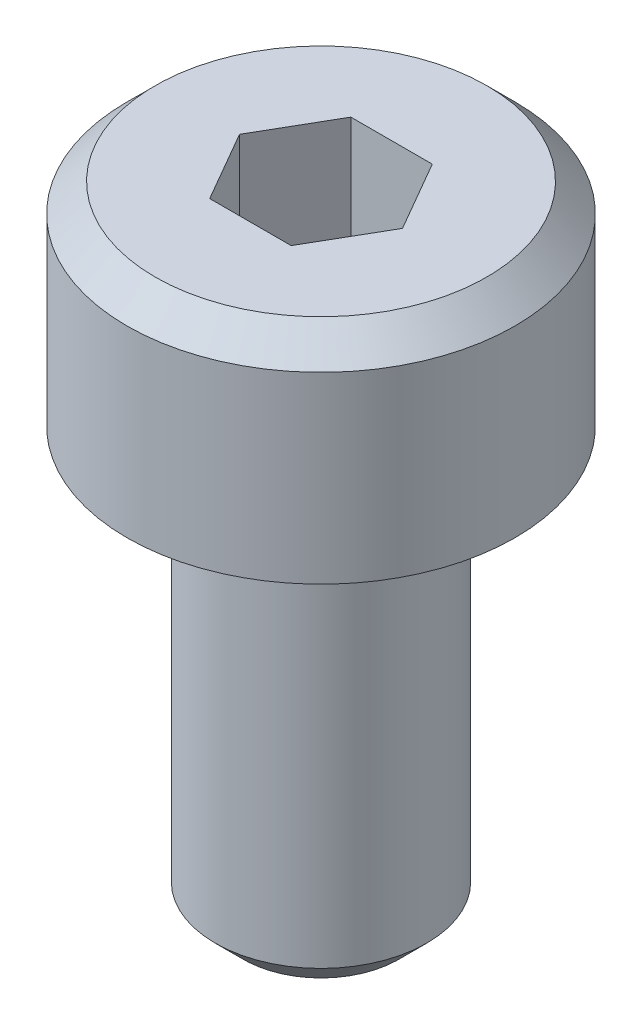
ISO-10303-21;
HEADER;
FILE_DESCRIPTION(('STEP AP214'),'2;1');
FILE_NAME('part.step','',(''),(''),'','','');
FILE_SCHEMA(('AUTOMOTIVE_DESIGN { 1 0 10303 214 1 1 1 1 }'));
ENDSEC;
DATA;
#1=APPLICATION_CONTEXT('core data for automotive mechanical design processes');
#2=APPLICATION_PROTOCOL_DEFINITION('international standard','automotive_design',2000,#1);
#3=PRODUCT_CONTEXT('',#1,'mechanical');
#4=PRODUCT('Part','Part','',(#3));
#5=PRODUCT_RELATED_PRODUCT_CATEGORY('part','',(#4));
#6=PRODUCT_DEFINITION_FORMATION('','',#4);
#7=PRODUCT_DEFINITION_CONTEXT('part definition',#1,'design');
#8=PRODUCT_DEFINITION('design','',#6,#7);
#9=PRODUCT_DEFINITION_SHAPE('','',#8);
#10=(LENGTH_UNIT() NAMED_UNIT(*) SI_UNIT(.MILLI.,.METRE.));
#11=(NAMED_UNIT(*) PLANE_ANGLE_UNIT() SI_UNIT($,.RADIAN.));
#12=(NAMED_UNIT(*) SI_UNIT($,.STERADIAN.) SOLID_ANGLE_UNIT());
#13=UNCERTAINTY_MEASURE_WITH_UNIT(LENGTH_MEASURE(1.E-05),#10,'distance_accuracy_value','');
#14=(GEOMETRIC_REPRESENTATION_CONTEXT(3) GLOBAL_UNCERTAINTY_ASSIGNED_CONTEXT((#13)) GLOBAL_UNIT_ASSIGNED_CONTEXT((#10,
#11,#12)) REPRESENTATION_CONTEXT('',''));
#15=CARTESIAN_POINT('',(0.,0.,0.));
#16=DIRECTION('',(0.,0.,1.));
#17=DIRECTION('',(1.,0.,0.));
#18=AXIS2_PLACEMENT_3D('',#15,#16,#17);
#19=CARTESIAN_POINT('',(0.,9.,0.));
#20=DIRECTION('',(0.,1.,0.));
#21=DIRECTION('',(0.,0.,1.));
#22=AXIS2_PLACEMENT_3D('',#19,#20,#21);
#23=PLANE('',#22);
#24=DIRECTION('',(0.499999999999999,0.,-0.866025403784439));
#25=VECTOR('',#24,1.);
#26=CARTESIAN_POINT('',(0.577350269189626,9.,1.));
#27=LINE('',#26,#25);
#28=CARTESIAN_POINT('',(0.577350269189626,9.,1.));
#29=VERTEX_POINT('',#28);
#30=CARTESIAN_POINT('',(1.15470053837925,9.,0.));
#31=VERTEX_POINT('',#30);
#32=EDGE_CURVE('E55',#29,#31,#27,.T.);
#33=ORIENTED_EDGE('',*,*,#32,.F.);
#34=DIRECTION('',(1.,0.,0.));
#35=VECTOR('',#34,1.);
#36=CARTESIAN_POINT('',(-0.577350269189626,9.,1.));
#37=LINE('',#36,#35);
#38=CARTESIAN_POINT('',(-0.577350269189626,9.,1.));
#39=VERTEX_POINT('',#38);
#40=EDGE_CURVE('E148',#39,#29,#37,.T.);
#41=ORIENTED_EDGE('',*,*,#40,.F.);
#42=DIRECTION('',(0.5,0.,0.866025403784439));
#43=VECTOR('',#42,1.);
#44=CARTESIAN_POINT('',(-1.15470053837925,9.,0.));
#45=LINE('',#44,#43);
#46=CARTESIAN_POINT('',(-1.15470053837925,9.,0.));
#47=VERTEX_POINT('',#46);
#48=EDGE_CURVE('E145',#47,#39,#45,.T.);
#49=ORIENTED_EDGE('',*,*,#48,.F.);
#50=DIRECTION('',(-0.5,0.,0.866025403784439));
#51=VECTOR('',#50,1.);
#52=CARTESIAN_POINT('',(-0.577350269189626,9.,-1.));
#53=LINE('',#52,#51);
#54=CARTESIAN_POINT('',(-0.577350269189626,9.,-1.));
#55=VERTEX_POINT('',#54);
#56=EDGE_CURVE('E103',#55,#47,#53,.T.);
#57=ORIENTED_EDGE('',*,*,#56,.F.);
#58=DIRECTION('',(-1.,0.,0.));
#59=VECTOR('',#58,1.);
#60=CARTESIAN_POINT('',(0.577350269189625,9.,-1.));
#61=LINE('',#60,#59);
#62=CARTESIAN_POINT('',(0.577350269189625,9.,-1.));
#63=VERTEX_POINT('',#62);
#64=EDGE_CURVE('E139',#63,#55,#61,.T.);
#65=ORIENTED_EDGE('',*,*,#64,.F.);
#66=DIRECTION('',(-0.5,0.,-0.866025403784438));
#67=VECTOR('',#66,1.);
#68=CARTESIAN_POINT('',(1.15470053837925,9.,0.));
#69=LINE('',#68,#67);
#70=EDGE_CURVE('E135',#31,#63,#69,.T.);
#71=ORIENTED_EDGE('',*,*,#70,.F.);
#72=EDGE_LOOP('',(#33,#41,#49,#57,#65,#71));
#73=FACE_BOUND('',#72,.T.);
#74=CARTESIAN_POINT('',(0.,9.,0.));
#75=DIRECTION('',(0.,1.,0.));
#76=DIRECTION('',(0.,0.,1.));
#77=AXIS2_PLACEMENT_3D('',#74,#75,#76);
#78=CIRCLE('',#77,2.35);
#79=CARTESIAN_POINT('',(0.,9.,-2.35));
#80=VERTEX_POINT('',#79);
#81=EDGE_CURVE('E175',#80,#80,#78,.T.);
#82=ORIENTED_EDGE('',*,*,#81,.T.);
#83=EDGE_LOOP('',(#82));
#84=FACE_BOUND('',#83,.T.);
#85=ADVANCED_FACE('F39',(#73,#84),#23,.T.);
#86=CARTESIAN_POINT('',(0.,0.,0.));
#87=DIRECTION('',(0.,-1.,0.));
#88=DIRECTION('',(0.,0.,-1.));
#89=AXIS2_PLACEMENT_3D('',#86,#87,#88);
#90=CYLINDRICAL_SURFACE('',#89,2.75);
#91=CARTESIAN_POINT('',(0.,8.6,0.));
#92=DIRECTION('',(0.,1.,0.));
#93=DIRECTION('',(0.,0.,1.));
#94=AXIS2_PLACEMENT_3D('',#91,#92,#93);
#95=CIRCLE('',#94,2.75);
#96=CARTESIAN_POINT('',(0.,8.6,-2.75));
#97=VERTEX_POINT('',#96);
#98=EDGE_CURVE('E171',#97,#97,#95,.F.);
#99=ORIENTED_EDGE('',*,*,#98,.T.);
#100=EDGE_LOOP('',(#99));
#101=FACE_BOUND('',#100,.T.);
#102=CARTESIAN_POINT('',(0.,6.,0.));
#103=DIRECTION('',(0.,-1.,0.));
#104=DIRECTION('',(0.,0.,-1.));
#105=AXIS2_PLACEMENT_3D('',#102,#103,#104);
#106=CIRCLE('',#105,2.75);
#107=CARTESIAN_POINT('',(0.,6.,-2.75));
#108=VERTEX_POINT('',#107);
#109=EDGE_CURVE('E167',#108,#108,#106,.T.);
#110=ORIENTED_EDGE('',*,*,#109,.F.);
#111=EDGE_LOOP('',(#110));
#112=FACE_BOUND('',#111,.T.);
#113=ADVANCED_FACE('F197',(#101,#112),#90,.T.);
#114=CARTESIAN_POINT('',(2.75,6.,0.));
#115=DIRECTION('',(0.,-1.,0.));
#116=DIRECTION('',(0.,0.,-1.));
#117=AXIS2_PLACEMENT_3D('',#114,#115,#116);
#118=PLANE('',#117);
#119=ORIENTED_EDGE('',*,*,#109,.T.);
#120=EDGE_LOOP('',(#119));
#121=FACE_BOUND('',#120,.T.);
#122=CARTESIAN_POINT('',(0.,6.,0.));
#123=DIRECTION('',(0.,-1.,0.));
#124=DIRECTION('',(0.,0.,-1.));
#125=AXIS2_PLACEMENT_3D('',#122,#123,#124);
#126=CIRCLE('',#125,1.5);
#127=CARTESIAN_POINT('',(0.,6.,-1.5));
#128=VERTEX_POINT('',#127);
#129=EDGE_CURVE('E154',#128,#128,#126,.T.);
#130=ORIENTED_EDGE('',*,*,#129,.F.);
#131=EDGE_LOOP('',(#130));
#132=FACE_BOUND('',#131,.T.);
#133=ADVANCED_FACE('F203',(#121,#132),#118,.T.);
#134=CARTESIAN_POINT('',(0.,0.,0.));
#135=DIRECTION('',(0.,-1.,0.));
#136=DIRECTION('',(0.,0.,-1.));
#137=AXIS2_PLACEMENT_3D('',#134,#135,#136);
#138=CYLINDRICAL_SURFACE('',#137,1.5);
#139=CARTESIAN_POINT('',(0.,0.400000000000002,0.));
#140=DIRECTION('',(0.,-1.,0.));
#141=DIRECTION('',(0.,0.,-1.));
#142=AXIS2_PLACEMENT_3D('',#139,#140,#141);
#143=CIRCLE('',#142,1.5);
#144=CARTESIAN_POINT('',(0.,0.400000000000002,-1.5));
#145=VERTEX_POINT('',#144);
#146=EDGE_CURVE('E11',#145,#145,#143,.F.);
#147=ORIENTED_EDGE('',*,*,#146,.T.);
#148=EDGE_LOOP('',(#147));
#149=FACE_BOUND('',#148,.T.);
#150=ORIENTED_EDGE('',*,*,#129,.T.);
#151=EDGE_LOOP('',(#150));
#152=FACE_BOUND('',#151,.T.);
#153=ADVANCED_FACE('F210',(#149,#152),#138,.T.);
#154=CARTESIAN_POINT('',(1.5,0.,0.));
#155=DIRECTION('',(0.,-1.,0.));
#156=DIRECTION('',(0.,0.,-1.));
#157=AXIS2_PLACEMENT_3D('',#154,#155,#156);
#158=PLANE('',#157);
#159=CARTESIAN_POINT('',(0.,0.,0.));
#160=DIRECTION('',(0.,-1.,0.));
#161=DIRECTION('',(0.,0.,-1.));
#162=AXIS2_PLACEMENT_3D('',#159,#160,#161);
#163=CIRCLE('',#162,1.1);
#164=CARTESIAN_POINT('',(0.,0.,-1.1));
#165=VERTEX_POINT('',#164);
#166=EDGE_CURVE('E48',#165,#165,#163,.T.);
#167=ORIENTED_EDGE('',*,*,#166,.T.);
#168=EDGE_LOOP('',(#167));
#169=FACE_BOUND('',#168,.T.);
#170=ADVANCED_FACE('F182',(#169),#158,.T.);
#171=CARTESIAN_POINT('',(0.,8.6,0.));
#172=DIRECTION('',(0.,-1.,0.));
#173=DIRECTION('',(0.,0.,-1.));
#174=AXIS2_PLACEMENT_3D('',#171,#172,#173);
#175=CONICAL_SURFACE('',#174,2.75,0.785398163397452);
#176=CARTESIAN_POINT('',(0.,9.,-2.35));
#177=CARTESIAN_POINT('',(0.,8.99583333333333,-2.35416666666667));
#178=CARTESIAN_POINT('',(0.,8.99166666666667,-2.35833333333333));
#179=CARTESIAN_POINT('',(0.,8.98333333333333,-2.36666666666667));
#180=CARTESIAN_POINT('',(0.,8.97916666666666,-2.37083333333333));
#181=CARTESIAN_POINT('',(0.,8.97083333333333,-2.37916666666667));
#182=CARTESIAN_POINT('',(0.,8.96666666666667,-2.38333333333333));
#183=CARTESIAN_POINT('',(0.,8.95833333333333,-2.39166666666667));
#184=CARTESIAN_POINT('',(0.,8.95416666666666,-2.39583333333333));
#185=CARTESIAN_POINT('',(0.,8.94583333333333,-2.40416666666667));
#186=CARTESIAN_POINT('',(0.,8.94166666666666,-2.40833333333333));
#187=CARTESIAN_POINT('',(0.,8.93333333333333,-2.41666666666667));
#188=CARTESIAN_POINT('',(0.,8.92916666666667,-2.42083333333333));
#189=CARTESIAN_POINT('',(0.,8.92083333333333,-2.42916666666667));
#190=CARTESIAN_POINT('',(0.,8.91666666666666,-2.43333333333333));
#191=CARTESIAN_POINT('',(0.,8.90833333333333,-2.44166666666667));
#192=CARTESIAN_POINT('',(0.,8.90416666666667,-2.44583333333333));
#193=CARTESIAN_POINT('',(0.,8.89583333333333,-2.45416666666667));
#194=CARTESIAN_POINT('',(0.,8.89166666666666,-2.45833333333333));
#195=CARTESIAN_POINT('',(0.,8.88333333333333,-2.46666666666667));
#196=CARTESIAN_POINT('',(0.,8.87916666666666,-2.47083333333333));
#197=CARTESIAN_POINT('',(0.,8.87083333333333,-2.47916666666667));
#198=CARTESIAN_POINT('',(0.,8.86666666666667,-2.48333333333333));
#199=CARTESIAN_POINT('',(0.,8.85833333333333,-2.49166666666667));
#200=CARTESIAN_POINT('',(0.,8.85416666666666,-2.49583333333333));
#201=CARTESIAN_POINT('',(0.,8.84583333333333,-2.50416666666667));
#202=CARTESIAN_POINT('',(0.,8.84166666666667,-2.50833333333333));
#203=CARTESIAN_POINT('',(0.,8.83333333333333,-2.51666666666667));
#204=CARTESIAN_POINT('',(0.,8.82916666666667,-2.52083333333333));
#205=CARTESIAN_POINT('',(0.,8.82083333333333,-2.52916666666667));
#206=CARTESIAN_POINT('',(0.,8.81666666666666,-2.53333333333333));
#207=CARTESIAN_POINT('',(0.,8.80833333333333,-2.54166666666667));
#208=CARTESIAN_POINT('',(0.,8.80416666666667,-2.54583333333333));
#209=CARTESIAN_POINT('',(0.,8.79583333333333,-2.55416666666667));
#210=CARTESIAN_POINT('',(0.,8.79166666666666,-2.55833333333333));
#211=CARTESIAN_POINT('',(0.,8.78333333333333,-2.56666666666667));
#212=CARTESIAN_POINT('',(0.,8.77916666666667,-2.57083333333333));
#213=CARTESIAN_POINT('',(0.,8.77083333333333,-2.57916666666667));
#214=CARTESIAN_POINT('',(0.,8.76666666666667,-2.58333333333333));
#215=CARTESIAN_POINT('',(0.,8.75833333333333,-2.59166666666667));
#216=CARTESIAN_POINT('',(0.,8.75416666666666,-2.59583333333333));
#217=CARTESIAN_POINT('',(0.,8.74583333333333,-2.60416666666667));
#218=CARTESIAN_POINT('',(0.,8.74166666666667,-2.60833333333333));
#219=CARTESIAN_POINT('',(0.,8.73333333333333,-2.61666666666667));
#220=CARTESIAN_POINT('',(0.,8.72916666666666,-2.62083333333333));
#221=CARTESIAN_POINT('',(0.,8.72083333333333,-2.62916666666667));
#222=CARTESIAN_POINT('',(0.,8.71666666666667,-2.63333333333333));
#223=CARTESIAN_POINT('',(0.,8.70833333333333,-2.64166666666667));
#224=CARTESIAN_POINT('',(0.,8.70416666666667,-2.64583333333333));
#225=CARTESIAN_POINT('',(0.,8.69583333333333,-2.65416666666667));
#226=CARTESIAN_POINT('',(0.,8.69166666666666,-2.65833333333333));
#227=CARTESIAN_POINT('',(0.,8.68333333333333,-2.66666666666667));
#228=CARTESIAN_POINT('',(0.,8.67916666666667,-2.67083333333333));
#229=CARTESIAN_POINT('',(0.,8.67083333333333,-2.67916666666667));
#230=CARTESIAN_POINT('',(0.,8.66666666666666,-2.68333333333333));
#231=CARTESIAN_POINT('',(0.,8.65833333333333,-2.69166666666667));
#232=CARTESIAN_POINT('',(0.,8.65416666666667,-2.69583333333333));
#233=CARTESIAN_POINT('',(0.,8.64583333333333,-2.70416666666667));
#234=CARTESIAN_POINT('',(0.,8.64166666666667,-2.70833333333333));
#235=CARTESIAN_POINT('',(0.,8.63333333333333,-2.71666666666667));
#236=CARTESIAN_POINT('',(0.,8.62916666666666,-2.72083333333333));
#237=CARTESIAN_POINT('',(0.,8.62083333333333,-2.72916666666667));
#238=CARTESIAN_POINT('',(0.,8.61666666666667,-2.73333333333333));
#239=CARTESIAN_POINT('',(0.,8.60833333333333,-2.74166666666667));
#240=CARTESIAN_POINT('',(0.,8.60416666666667,-2.74583333333333));
#241=CARTESIAN_POINT('',(0.,8.6,-2.75));
#242=B_SPLINE_CURVE_WITH_KNOTS('',3,(#176,#177,#178,#179,#180,#181,#182,#183,#184,#185,#186,
#187,#188,#189,#190,#191,#192,#193,#194,#195,#196,#197,#198,#199,#200,#201,#202,#203,#204,#205,
#206,#207,#208,#209,#210,#211,#212,#213,#214,#215,#216,#217,#218,#219,#220,#221,#222,#223,#224,
#225,#226,#227,#228,#229,#230,#231,#232,#233,#234,#235,#236,#237,#238,#239,#240,#241),
.UNSPECIFIED.,.F.,.F.,(4,2,2,2,2,2,2,2,2,2,2,2,2,2,2,2,2,2,2,2,2,2,2,2,2,2,2,2,2,2,2,2,4),(0.,
0.0176776695296639,0.0353553390593278,0.053033008588992,0.0707106781186558,0.0883883476483185,
0.106066017177983,0.123743686707647,0.14142135623731,0.159099025766975,0.176776695296637,
0.194454364826302,0.212132034355965,0.229809703885629,0.247487373415292,0.265165042944956,
0.28284271247462,0.300520382004284,0.318198051533948,0.335875721063611,0.353553390593275,
0.371231060122939,0.388908729652603,0.406586399182266,0.42426406871193,0.441941738241594,
0.459619407771258,0.477297077300921,0.494974746830585,0.512652416360248,0.530330085889912,
0.548007755419576,0.565685424949239),.UNSPECIFIED.);
#243=EDGE_CURVE('BSEAM186',#80,#97,#242,.T.);
#244=ORIENTED_EDGE('',*,*,#81,.F.);
#245=ORIENTED_EDGE('',*,*,#98,.F.);
#246=ORIENTED_EDGE('',*,*,#243,.T.);
#247=ORIENTED_EDGE('',*,*,#243,.F.);
#248=EDGE_LOOP('',(#244,#246,#245,#247));
#249=FACE_BOUND('',#248,.T.);
#250=ADVANCED_FACE('F186',(#249),#175,.T.);
#251=CARTESIAN_POINT('',(0.,0.,0.));
#252=DIRECTION('',(0.,1.,0.));
#253=DIRECTION('',(0.,0.,1.));
#254=AXIS2_PLACEMENT_3D('',#251,#252,#253);
#255=CONICAL_SURFACE('',#254,1.1,0.785398163397447);
#256=ORIENTED_EDGE('',*,*,#146,.F.);
#257=EDGE_LOOP('',(#256));
#258=FACE_BOUND('',#257,.T.);
#259=ORIENTED_EDGE('',*,*,#166,.F.);
#260=EDGE_LOOP('',(#259));
#261=FACE_BOUND('',#260,.T.);
#262=ADVANCED_FACE('F41',(#258,#261),#255,.T.);
#263=CARTESIAN_POINT('',(0.577350269189626,5.,1.));
#264=DIRECTION('',(0.866025403784439,0.,0.5));
#265=DIRECTION('',(0.499999999999999,0.,-0.866025403784439));
#266=AXIS2_PLACEMENT_3D('',#263,#264,#265);
#267=PLANE('',#266);
#268=ORIENTED_EDGE('',*,*,#32,.T.);
#269=DIRECTION('',(0.,1.,0.));
#270=VECTOR('',#269,1.);
#271=CARTESIAN_POINT('',(1.15470053837925,5.,0.));
#272=LINE('',#271,#270);
#273=CARTESIAN_POINT('',(1.15470053837925,5.,0.));
#274=VERTEX_POINT('',#273);
#275=EDGE_CURVE('E85',#274,#31,#272,.T.);
#276=ORIENTED_EDGE('',*,*,#275,.F.);
#277=DIRECTION('',(0.499999999999999,0.,-0.866025403784439));
#278=VECTOR('',#277,1.);
#279=CARTESIAN_POINT('',(0.577350269189626,5.,1.));
#280=LINE('',#279,#278);
#281=CARTESIAN_POINT('',(0.577350269189626,5.,1.));
#282=VERTEX_POINT('',#281);
#283=EDGE_CURVE('E151',#282,#274,#280,.T.);
#284=ORIENTED_EDGE('',*,*,#283,.F.);
#285=DIRECTION('',(0.,1.,0.));
#286=VECTOR('',#285,1.);
#287=CARTESIAN_POINT('',(0.577350269189626,5.,1.));
#288=LINE('',#287,#286);
#289=EDGE_CURVE('E63',#282,#29,#288,.T.);
#290=ORIENTED_EDGE('',*,*,#289,.T.);
#291=EDGE_LOOP('',(#268,#276,#284,#290));
#292=FACE_BOUND('',#291,.T.);
#293=ADVANCED_FACE('F185',(#292),#267,.F.);
#294=CARTESIAN_POINT('',(-0.577350269189626,5.,1.));
#295=DIRECTION('',(0.,0.,1.));
#296=DIRECTION('',(1.,0.,0.));
#297=AXIS2_PLACEMENT_3D('',#294,#295,#296);
#298=PLANE('',#297);
#299=ORIENTED_EDGE('',*,*,#40,.T.);
#300=ORIENTED_EDGE('',*,*,#289,.F.);
#301=DIRECTION('',(1.,0.,0.));
#302=VECTOR('',#301,1.);
#303=CARTESIAN_POINT('',(-0.577350269189626,5.,1.));
#304=LINE('',#303,#302);
#305=CARTESIAN_POINT('',(-0.577350269189626,5.,1.));
#306=VERTEX_POINT('',#305);
#307=EDGE_CURVE('E117',#306,#282,#304,.T.);
#308=ORIENTED_EDGE('',*,*,#307,.F.);
#309=DIRECTION('',(0.,1.,0.));
#310=VECTOR('',#309,1.);
#311=CARTESIAN_POINT('',(-0.577350269189626,5.,1.));
#312=LINE('',#311,#310);
#313=EDGE_CURVE('E108',#306,#39,#312,.T.);
#314=ORIENTED_EDGE('',*,*,#313,.T.);
#315=EDGE_LOOP('',(#299,#300,#308,#314));
#316=FACE_BOUND('',#315,.T.);
#317=ADVANCED_FACE('F192',(#316),#298,.F.);
#318=CARTESIAN_POINT('',(-1.15470053837925,5.,0.));
#319=DIRECTION('',(-0.866025403784439,0.,0.5));
#320=DIRECTION('',(0.5,0.,0.866025403784439));
#321=AXIS2_PLACEMENT_3D('',#318,#319,#320);
#322=PLANE('',#321);
#323=ORIENTED_EDGE('',*,*,#48,.T.);
#324=ORIENTED_EDGE('',*,*,#313,.F.);
#325=DIRECTION('',(0.5,0.,0.866025403784439));
#326=VECTOR('',#325,1.);
#327=CARTESIAN_POINT('',(-1.15470053837925,5.,0.));
#328=LINE('',#327,#326);
#329=CARTESIAN_POINT('',(-1.15470053837925,5.,0.));
#330=VERTEX_POINT('',#329);
#331=EDGE_CURVE('E112',#330,#306,#328,.T.);
#332=ORIENTED_EDGE('',*,*,#331,.F.);
#333=DIRECTION('',(0.,1.,0.));
#334=VECTOR('',#333,1.);
#335=CARTESIAN_POINT('',(-1.15470053837925,5.,0.));
#336=LINE('',#335,#334);
#337=EDGE_CURVE('E96',#330,#47,#336,.T.);
#338=ORIENTED_EDGE('',*,*,#337,.T.);
#339=EDGE_LOOP('',(#323,#324,#332,#338));
#340=FACE_BOUND('',#339,.T.);
#341=ADVANCED_FACE('F113',(#340),#322,.F.);
#342=CARTESIAN_POINT('',(-0.577350269189626,5.,-1.));
#343=DIRECTION('',(-0.866025403784439,0.,-0.5));
#344=DIRECTION('',(-0.5,0.,0.866025403784439));
#345=AXIS2_PLACEMENT_3D('',#342,#343,#344);
#346=PLANE('',#345);
#347=ORIENTED_EDGE('',*,*,#56,.T.);
#348=ORIENTED_EDGE('',*,*,#337,.F.);
#349=DIRECTION('',(-0.5,0.,0.866025403784439));
#350=VECTOR('',#349,1.);
#351=CARTESIAN_POINT('',(-0.577350269189626,5.,-1.));
#352=LINE('',#351,#350);
#353=CARTESIAN_POINT('',(-0.577350269189626,5.,-1.));
#354=VERTEX_POINT('',#353);
#355=EDGE_CURVE('E100',#354,#330,#352,.T.);
#356=ORIENTED_EDGE('',*,*,#355,.F.);
#357=DIRECTION('',(0.,1.,0.));
#358=VECTOR('',#357,1.);
#359=CARTESIAN_POINT('',(-0.577350269189626,5.,-1.));
#360=LINE('',#359,#358);
#361=EDGE_CURVE('E109',#354,#55,#360,.T.);
#362=ORIENTED_EDGE('',*,*,#361,.T.);
#363=EDGE_LOOP('',(#347,#348,#356,#362));
#364=FACE_BOUND('',#363,.T.);
#365=ADVANCED_FACE('F98',(#364),#346,.F.);
#366=CARTESIAN_POINT('',(0.577350269189625,5.,-1.));
#367=DIRECTION('',(0.,0.,-1.));
#368=DIRECTION('',(-1.,0.,0.));
#369=AXIS2_PLACEMENT_3D('',#366,#367,#368);
#370=PLANE('',#369);
#371=ORIENTED_EDGE('',*,*,#64,.T.);
#372=ORIENTED_EDGE('',*,*,#361,.F.);
#373=DIRECTION('',(-1.,0.,0.));
#374=VECTOR('',#373,1.);
#375=CARTESIAN_POINT('',(0.577350269189625,5.,-1.));
#376=LINE('',#375,#374);
#377=CARTESIAN_POINT('',(0.577350269189625,5.,-1.));
#378=VERTEX_POINT('',#377);
#379=EDGE_CURVE('E123',#378,#354,#376,.T.);
#380=ORIENTED_EDGE('',*,*,#379,.F.);
#381=DIRECTION('',(0.,1.,0.));
#382=VECTOR('',#381,1.);
#383=CARTESIAN_POINT('',(0.577350269189625,5.,-1.));
#384=LINE('',#383,#382);
#385=EDGE_CURVE('E159',#378,#63,#384,.T.);
#386=ORIENTED_EDGE('',*,*,#385,.T.);
#387=EDGE_LOOP('',(#371,#372,#380,#386));
#388=FACE_BOUND('',#387,.T.);
#389=ADVANCED_FACE('F220',(#388),#370,.F.);
#390=CARTESIAN_POINT('',(1.15470053837925,5.,0.));
#391=DIRECTION('',(0.866025403784439,0.,-0.5));
#392=DIRECTION('',(-0.5,0.,-0.866025403784438));
#393=AXIS2_PLACEMENT_3D('',#390,#391,#392);
#394=PLANE('',#393);
#395=ORIENTED_EDGE('',*,*,#70,.T.);
#396=ORIENTED_EDGE('',*,*,#385,.F.);
#397=DIRECTION('',(-0.5,0.,-0.866025403784438));
#398=VECTOR('',#397,1.);
#399=CARTESIAN_POINT('',(1.15470053837925,5.,0.));
#400=LINE('',#399,#398);
#401=EDGE_CURVE('E127',#274,#378,#400,.T.);
#402=ORIENTED_EDGE('',*,*,#401,.F.);
#403=ORIENTED_EDGE('',*,*,#275,.T.);
#404=EDGE_LOOP('',(#395,#396,#402,#403));
#405=FACE_BOUND('',#404,.T.);
#406=ADVANCED_FACE('F217',(#405),#394,.F.);
#407=CARTESIAN_POINT('',(0.,5.,0.));
#408=DIRECTION('',(0.,1.,0.));
#409=DIRECTION('',(0.,0.,1.));
#410=AXIS2_PLACEMENT_3D('',#407,#408,#409);
#411=PLANE('',#410);
#412=ORIENTED_EDGE('',*,*,#283,.T.);
#413=ORIENTED_EDGE('',*,*,#401,.T.);
#414=ORIENTED_EDGE('',*,*,#379,.T.);
#415=ORIENTED_EDGE('',*,*,#355,.T.);
#416=ORIENTED_EDGE('',*,*,#331,.T.);
#417=ORIENTED_EDGE('',*,*,#307,.T.);
#418=EDGE_LOOP('',(#412,#413,#414,#415,#416,#417));
#419=FACE_BOUND('',#418,.T.);
#420=ADVANCED_FACE('F120',(#419),#411,.T.);
#421=CLOSED_SHELL('',(#85,#113,#133,#153,#170,#250,#262,#293,#317,#341,#365,#389,#406,#420));
#422=MANIFOLD_SOLID_BREP('B2',#421);
#423=ADVANCED_BREP_SHAPE_REPRESENTATION('',(#18,#422),#14);
#424=SHAPE_DEFINITION_REPRESENTATION(#9,#423);
ENDSEC;
END-ISO-10303-21;
